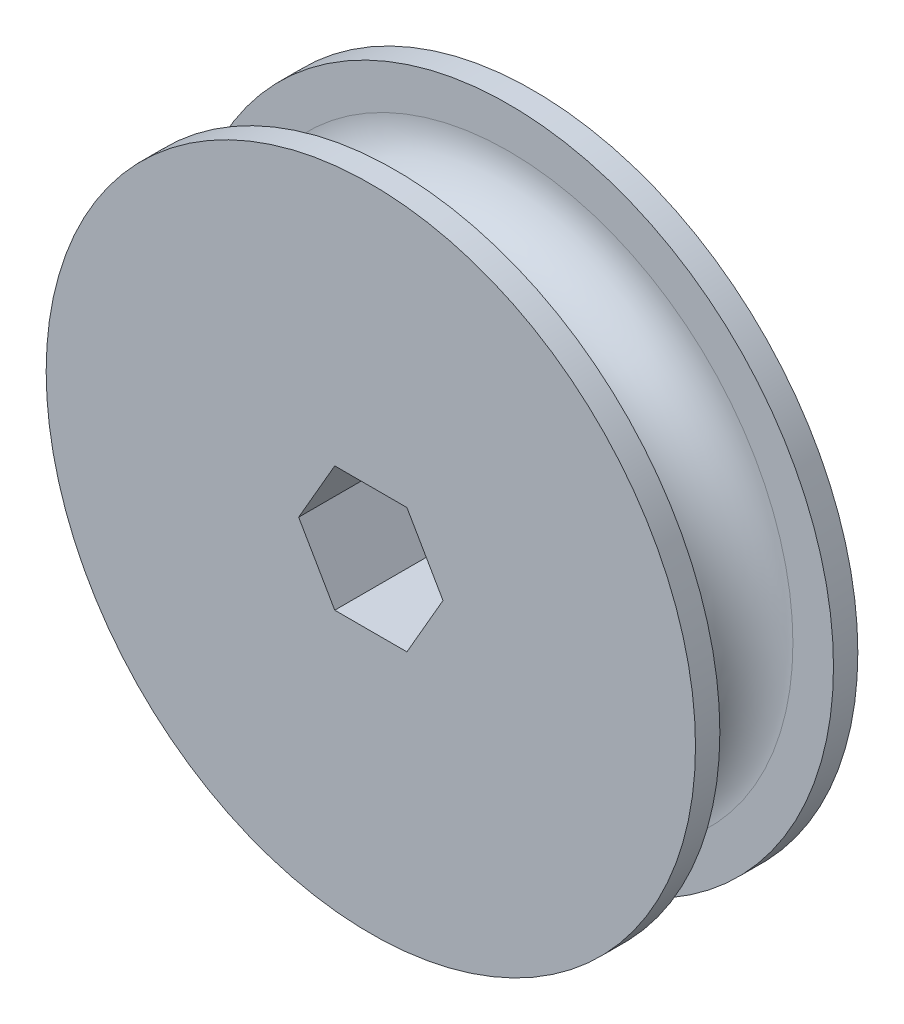
ISO-10303-21;
HEADER;
FILE_DESCRIPTION(('STEP AP214'),'2;1');
FILE_NAME('part.step','',(''),(''),'','','');
FILE_SCHEMA(('AUTOMOTIVE_DESIGN { 1 0 10303 214 1 1 1 1 }'));
ENDSEC;
DATA;
#1=APPLICATION_CONTEXT('core data for automotive mechanical design processes');
#2=APPLICATION_PROTOCOL_DEFINITION('international standard','automotive_design',2000,#1);
#3=PRODUCT_CONTEXT('',#1,'mechanical');
#4=PRODUCT('Part','Part','',(#3));
#5=PRODUCT_RELATED_PRODUCT_CATEGORY('part','',(#4));
#6=PRODUCT_DEFINITION_FORMATION('','',#4);
#7=PRODUCT_DEFINITION_CONTEXT('part definition',#1,'design');
#8=PRODUCT_DEFINITION('design','',#6,#7);
#9=PRODUCT_DEFINITION_SHAPE('','',#8);
#10=(LENGTH_UNIT() NAMED_UNIT(*) SI_UNIT(.MILLI.,.METRE.));
#11=(NAMED_UNIT(*) PLANE_ANGLE_UNIT() SI_UNIT($,.RADIAN.));
#12=(NAMED_UNIT(*) SI_UNIT($,.STERADIAN.) SOLID_ANGLE_UNIT());
#13=UNCERTAINTY_MEASURE_WITH_UNIT(LENGTH_MEASURE(1.E-05),#10,'distance_accuracy_value','');
#14=(GEOMETRIC_REPRESENTATION_CONTEXT(3) GLOBAL_UNCERTAINTY_ASSIGNED_CONTEXT((#13)) GLOBAL_UNIT_ASSIGNED_CONTEXT((#10,
#11,#12)) REPRESENTATION_CONTEXT('',''));
#15=CARTESIAN_POINT('',(0.,0.,0.));
#16=DIRECTION('',(0.,0.,1.));
#17=DIRECTION('',(1.,0.,0.));
#18=AXIS2_PLACEMENT_3D('',#15,#16,#17);
#19=CARTESIAN_POINT('',(0.,0.,6.35));
#20=DIRECTION('',(0.,0.,-1.));
#21=DIRECTION('',(-1.,0.,0.));
#22=AXIS2_PLACEMENT_3D('',#19,#20,#21);
#23=CYLINDRICAL_SURFACE('',#22,25.4);
#24=CARTESIAN_POINT('',(0.,0.,-6.35));
#25=DIRECTION('',(0.,0.,1.));
#26=DIRECTION('',(1.,0.,0.));
#27=AXIS2_PLACEMENT_3D('',#24,#25,#26);
#28=CIRCLE('',#27,25.4);
#29=CARTESIAN_POINT('',(25.4,0.,-6.35));
#30=VERTEX_POINT('',#29);
#31=EDGE_CURVE('E36',#30,#30,#28,.T.);
#32=ORIENTED_EDGE('',*,*,#31,.T.);
#33=EDGE_LOOP('',(#32));
#34=FACE_BOUND('',#33,.T.);
#35=CARTESIAN_POINT('',(0.,0.,-4.445));
#36=DIRECTION('',(0.,0.,1.));
#37=DIRECTION('',(1.,0.,0.));
#38=AXIS2_PLACEMENT_3D('',#35,#36,#37);
#39=CIRCLE('',#38,25.4);
#40=CARTESIAN_POINT('',(25.4,0.,-4.445));
#41=VERTEX_POINT('',#40);
#42=EDGE_CURVE('E143',#41,#41,#39,.T.);
#43=ORIENTED_EDGE('',*,*,#42,.F.);
#44=EDGE_LOOP('',(#43));
#45=FACE_BOUND('',#44,.T.);
#46=ADVANCED_FACE('F33',(#34,#45),#23,.T.);
#47=CARTESIAN_POINT('',(0.,0.,-6.35));
#48=DIRECTION('',(0.,0.,1.));
#49=DIRECTION('',(1.,0.,0.));
#50=AXIS2_PLACEMENT_3D('',#47,#48,#49);
#51=PLANE('',#50);
#52=DIRECTION('',(0.499999999999998,0.86602540378444,0.));
#53=VECTOR('',#52,1.);
#54=CARTESIAN_POINT('',(-5.64590828240534,0.,-6.35));
#55=LINE('',#54,#53);
#56=CARTESIAN_POINT('',(-5.64590828240534,0.,-6.35));
#57=VERTEX_POINT('',#56);
#58=CARTESIAN_POINT('',(-2.82295414120268,4.8895,-6.35));
#59=VERTEX_POINT('',#58);
#60=EDGE_CURVE('E118',#57,#59,#55,.T.);
#61=ORIENTED_EDGE('',*,*,#60,.F.);
#62=DIRECTION('',(-0.499999999999999,0.86602540378444,0.));
#63=VECTOR('',#62,1.);
#64=CARTESIAN_POINT('',(-2.82295414120268,-4.8895,-6.35));
#65=LINE('',#64,#63);
#66=CARTESIAN_POINT('',(-2.82295414120268,-4.8895,-6.35));
#67=VERTEX_POINT('',#66);
#68=EDGE_CURVE('E47',#67,#57,#65,.T.);
#69=ORIENTED_EDGE('',*,*,#68,.F.);
#70=DIRECTION('',(-1.,0.,0.));
#71=VECTOR('',#70,1.);
#72=CARTESIAN_POINT('',(2.82295414120269,-4.8895,-6.35));
#73=LINE('',#72,#71);
#74=CARTESIAN_POINT('',(2.82295414120269,-4.8895,-6.35));
#75=VERTEX_POINT('',#74);
#76=EDGE_CURVE('E104',#75,#67,#73,.T.);
#77=ORIENTED_EDGE('',*,*,#76,.F.);
#78=DIRECTION('',(-0.499999999999998,-0.86602540378444,0.));
#79=VECTOR('',#78,1.);
#80=CARTESIAN_POINT('',(5.64590828240535,0.,-6.35));
#81=LINE('',#80,#79);
#82=CARTESIAN_POINT('',(5.64590828240535,0.,-6.35));
#83=VERTEX_POINT('',#82);
#84=EDGE_CURVE('E107',#83,#75,#81,.T.);
#85=ORIENTED_EDGE('',*,*,#84,.F.);
#86=DIRECTION('',(0.499999999999999,-0.86602540378444,0.));
#87=VECTOR('',#86,1.);
#88=CARTESIAN_POINT('',(2.82295414120268,4.8895,-6.35));
#89=LINE('',#88,#87);
#90=CARTESIAN_POINT('',(2.82295414120268,4.8895,-6.35));
#91=VERTEX_POINT('',#90);
#92=EDGE_CURVE('E123',#91,#83,#89,.T.);
#93=ORIENTED_EDGE('',*,*,#92,.F.);
#94=DIRECTION('',(1.,0.,0.));
#95=VECTOR('',#94,1.);
#96=CARTESIAN_POINT('',(-2.82295414120268,4.8895,-6.35));
#97=LINE('',#96,#95);
#98=EDGE_CURVE('E120',#59,#91,#97,.T.);
#99=ORIENTED_EDGE('',*,*,#98,.F.);
#100=EDGE_LOOP('',(#61,#69,#77,#85,#93,#99));
#101=FACE_BOUND('',#100,.T.);
#102=ORIENTED_EDGE('',*,*,#31,.F.);
#103=EDGE_LOOP('',(#102));
#104=FACE_BOUND('',#103,.T.);
#105=ADVANCED_FACE('F155',(#101,#104),#51,.F.);
#106=CARTESIAN_POINT('',(0.,0.,0.));
#107=DIRECTION('',(0.,0.,1.));
#108=DIRECTION('',(1.,0.,0.));
#109=AXIS2_PLACEMENT_3D('',#106,#107,#108);
#110=TOROIDAL_SURFACE('',#109,22.225,4.445);
#111=CARTESIAN_POINT('',(0.,0.,-4.445));
#112=DIRECTION('',(0.,0.,1.));
#113=DIRECTION('',(1.,0.,0.));
#114=AXIS2_PLACEMENT_3D('',#111,#112,#113);
#115=CIRCLE('',#114,22.225);
#116=CARTESIAN_POINT('',(22.225,0.,-4.445));
#117=VERTEX_POINT('',#116);
#118=EDGE_CURVE('E146',#117,#117,#115,.T.);
#119=ORIENTED_EDGE('',*,*,#118,.T.);
#120=EDGE_LOOP('',(#119));
#121=FACE_BOUND('',#120,.T.);
#122=CARTESIAN_POINT('',(0.,0.,4.445));
#123=DIRECTION('',(0.,0.,1.));
#124=DIRECTION('',(1.,0.,0.));
#125=AXIS2_PLACEMENT_3D('',#122,#123,#124);
#126=CIRCLE('',#125,22.225);
#127=CARTESIAN_POINT('',(22.225,0.,4.445));
#128=VERTEX_POINT('',#127);
#129=EDGE_CURVE('E130',#128,#128,#126,.T.);
#130=ORIENTED_EDGE('',*,*,#129,.F.);
#131=EDGE_LOOP('',(#130));
#132=FACE_BOUND('',#131,.T.);
#133=ADVANCED_FACE('F157',(#121,#132),#110,.F.);
#134=CARTESIAN_POINT('',(-22.225,0.,-4.445));
#135=DIRECTION('',(0.,0.,1.));
#136=DIRECTION('',(1.,0.,0.));
#137=AXIS2_PLACEMENT_3D('',#134,#135,#136);
#138=PLANE('',#137);
#139=ORIENTED_EDGE('',*,*,#42,.T.);
#140=EDGE_LOOP('',(#139));
#141=FACE_BOUND('',#140,.T.);
#142=ORIENTED_EDGE('',*,*,#118,.F.);
#143=EDGE_LOOP('',(#142));
#144=FACE_BOUND('',#143,.T.);
#145=ADVANCED_FACE('F163',(#141,#144),#138,.T.);
#146=CARTESIAN_POINT('',(-22.225,0.,4.445));
#147=DIRECTION('',(0.,0.,-1.));
#148=DIRECTION('',(-1.,0.,0.));
#149=AXIS2_PLACEMENT_3D('',#146,#147,#148);
#150=PLANE('',#149);
#151=ORIENTED_EDGE('',*,*,#129,.T.);
#152=EDGE_LOOP('',(#151));
#153=FACE_BOUND('',#152,.T.);
#154=CARTESIAN_POINT('',(0.,0.,4.445));
#155=DIRECTION('',(0.,0.,1.));
#156=DIRECTION('',(1.,0.,0.));
#157=AXIS2_PLACEMENT_3D('',#154,#155,#156);
#158=CIRCLE('',#157,25.4);
#159=CARTESIAN_POINT('',(25.4,0.,4.445));
#160=VERTEX_POINT('',#159);
#161=EDGE_CURVE('E140',#160,#160,#158,.T.);
#162=ORIENTED_EDGE('',*,*,#161,.F.);
#163=EDGE_LOOP('',(#162));
#164=FACE_BOUND('',#163,.T.);
#165=ADVANCED_FACE('F168',(#153,#164),#150,.T.);
#166=CARTESIAN_POINT('',(0.,0.,6.35));
#167=DIRECTION('',(0.,0.,1.));
#168=DIRECTION('',(1.,0.,0.));
#169=AXIS2_PLACEMENT_3D('',#166,#167,#168);
#170=PLANE('',#169);
#171=DIRECTION('',(-0.499999999999999,0.86602540378444,0.));
#172=VECTOR('',#171,1.);
#173=CARTESIAN_POINT('',(-2.82295414120268,-4.8895,6.35));
#174=LINE('',#173,#172);
#175=CARTESIAN_POINT('',(-2.82295414120268,-4.8895,6.35));
#176=VERTEX_POINT('',#175);
#177=CARTESIAN_POINT('',(-5.64590828240534,0.,6.35));
#178=VERTEX_POINT('',#177);
#179=EDGE_CURVE('E87',#176,#178,#174,.T.);
#180=ORIENTED_EDGE('',*,*,#179,.T.);
#181=DIRECTION('',(0.499999999999998,0.86602540378444,0.));
#182=VECTOR('',#181,1.);
#183=CARTESIAN_POINT('',(-5.64590828240534,0.,6.35));
#184=LINE('',#183,#182);
#185=CARTESIAN_POINT('',(-2.82295414120268,4.8895,6.35));
#186=VERTEX_POINT('',#185);
#187=EDGE_CURVE('E96',#178,#186,#184,.T.);
#188=ORIENTED_EDGE('',*,*,#187,.T.);
#189=DIRECTION('',(1.,0.,0.));
#190=VECTOR('',#189,1.);
#191=CARTESIAN_POINT('',(-2.82295414120268,4.8895,6.35));
#192=LINE('',#191,#190);
#193=CARTESIAN_POINT('',(2.82295414120268,4.8895,6.35));
#194=VERTEX_POINT('',#193);
#195=EDGE_CURVE('E55',#186,#194,#192,.T.);
#196=ORIENTED_EDGE('',*,*,#195,.T.);
#197=DIRECTION('',(0.499999999999999,-0.86602540378444,0.));
#198=VECTOR('',#197,1.);
#199=CARTESIAN_POINT('',(2.82295414120268,4.8895,6.35));
#200=LINE('',#199,#198);
#201=CARTESIAN_POINT('',(5.64590828240535,0.,6.35));
#202=VERTEX_POINT('',#201);
#203=EDGE_CURVE('E111',#194,#202,#200,.T.);
#204=ORIENTED_EDGE('',*,*,#203,.T.);
#205=DIRECTION('',(-0.499999999999998,-0.86602540378444,0.));
#206=VECTOR('',#205,1.);
#207=CARTESIAN_POINT('',(5.64590828240535,0.,6.35));
#208=LINE('',#207,#206);
#209=CARTESIAN_POINT('',(2.82295414120269,-4.8895,6.35));
#210=VERTEX_POINT('',#209);
#211=EDGE_CURVE('E114',#202,#210,#208,.T.);
#212=ORIENTED_EDGE('',*,*,#211,.T.);
#213=DIRECTION('',(-1.,0.,0.));
#214=VECTOR('',#213,1.);
#215=CARTESIAN_POINT('',(2.82295414120269,-4.8895,6.35));
#216=LINE('',#215,#214);
#217=EDGE_CURVE('E93',#210,#176,#216,.T.);
#218=ORIENTED_EDGE('',*,*,#217,.T.);
#219=EDGE_LOOP('',(#180,#188,#196,#204,#212,#218));
#220=FACE_BOUND('',#219,.T.);
#221=CARTESIAN_POINT('',(0.,0.,6.35));
#222=DIRECTION('',(0.,0.,1.));
#223=DIRECTION('',(1.,0.,0.));
#224=AXIS2_PLACEMENT_3D('',#221,#222,#223);
#225=CIRCLE('',#224,25.4);
#226=CARTESIAN_POINT('',(25.4,0.,6.35));
#227=VERTEX_POINT('',#226);
#228=EDGE_CURVE('E11',#227,#227,#225,.T.);
#229=ORIENTED_EDGE('',*,*,#228,.T.);
#230=EDGE_LOOP('',(#229));
#231=FACE_BOUND('',#230,.T.);
#232=ADVANCED_FACE('F100',(#220,#231),#170,.T.);
#233=ORIENTED_EDGE('',*,*,#228,.F.);
#234=EDGE_LOOP('',(#233));
#235=FACE_BOUND('',#234,.T.);
#236=ORIENTED_EDGE('',*,*,#161,.T.);
#237=EDGE_LOOP('',(#236));
#238=FACE_BOUND('',#237,.T.);
#239=ADVANCED_FACE('F165',(#235,#238),#23,.T.);
#240=CARTESIAN_POINT('',(-2.82295414120268,-4.8895,6.35));
#241=DIRECTION('',(-0.866025403784439,-0.499999999999999,0.));
#242=DIRECTION('',(0.499999999999999,-0.866025403784439,0.));
#243=AXIS2_PLACEMENT_3D('',#240,#241,#242);
#244=PLANE('',#243);
#245=ORIENTED_EDGE('',*,*,#68,.T.);
#246=DIRECTION('',(0.,0.,-1.));
#247=VECTOR('',#246,1.);
#248=CARTESIAN_POINT('',(-5.64590828240534,0.,6.35));
#249=LINE('',#248,#247);
#250=EDGE_CURVE('E83',#178,#57,#249,.T.);
#251=ORIENTED_EDGE('',*,*,#250,.F.);
#252=ORIENTED_EDGE('',*,*,#179,.F.);
#253=DIRECTION('',(0.,0.,-1.));
#254=VECTOR('',#253,1.);
#255=CARTESIAN_POINT('',(-2.82295414120268,-4.8895,6.35));
#256=LINE('',#255,#254);
#257=EDGE_CURVE('E128',#176,#67,#256,.T.);
#258=ORIENTED_EDGE('',*,*,#257,.T.);
#259=EDGE_LOOP('',(#245,#251,#252,#258));
#260=FACE_BOUND('',#259,.T.);
#261=ADVANCED_FACE('F85',(#260),#244,.F.);
#262=CARTESIAN_POINT('',(2.82295414120269,-4.8895,6.35));
#263=DIRECTION('',(0.,-1.,0.));
#264=DIRECTION('',(0.,0.,-1.));
#265=AXIS2_PLACEMENT_3D('',#262,#263,#264);
#266=PLANE('',#265);
#267=ORIENTED_EDGE('',*,*,#76,.T.);
#268=ORIENTED_EDGE('',*,*,#257,.F.);
#269=ORIENTED_EDGE('',*,*,#217,.F.);
#270=DIRECTION('',(0.,0.,-1.));
#271=VECTOR('',#270,1.);
#272=CARTESIAN_POINT('',(2.82295414120269,-4.8895,6.35));
#273=LINE('',#272,#271);
#274=EDGE_CURVE('E131',#210,#75,#273,.T.);
#275=ORIENTED_EDGE('',*,*,#274,.T.);
#276=EDGE_LOOP('',(#267,#268,#269,#275));
#277=FACE_BOUND('',#276,.T.);
#278=ADVANCED_FACE('F178',(#277),#266,.F.);
#279=CARTESIAN_POINT('',(5.64590828240535,0.,6.35));
#280=DIRECTION('',(0.86602540378444,-0.499999999999998,0.));
#281=DIRECTION('',(0.499999999999998,0.86602540378444,0.));
#282=AXIS2_PLACEMENT_3D('',#279,#280,#281);
#283=PLANE('',#282);
#284=ORIENTED_EDGE('',*,*,#84,.T.);
#285=ORIENTED_EDGE('',*,*,#274,.F.);
#286=ORIENTED_EDGE('',*,*,#211,.F.);
#287=DIRECTION('',(0.,0.,-1.));
#288=VECTOR('',#287,1.);
#289=CARTESIAN_POINT('',(5.64590828240535,0.,6.35));
#290=LINE('',#289,#288);
#291=EDGE_CURVE('E133',#202,#83,#290,.T.);
#292=ORIENTED_EDGE('',*,*,#291,.T.);
#293=EDGE_LOOP('',(#284,#285,#286,#292));
#294=FACE_BOUND('',#293,.T.);
#295=ADVANCED_FACE('F187',(#294),#283,.F.);
#296=CARTESIAN_POINT('',(2.82295414120268,4.8895,6.35));
#297=DIRECTION('',(0.866025403784439,0.499999999999999,0.));
#298=DIRECTION('',(-0.499999999999999,0.866025403784439,0.));
#299=AXIS2_PLACEMENT_3D('',#296,#297,#298);
#300=PLANE('',#299);
#301=ORIENTED_EDGE('',*,*,#92,.T.);
#302=ORIENTED_EDGE('',*,*,#291,.F.);
#303=ORIENTED_EDGE('',*,*,#203,.F.);
#304=DIRECTION('',(0.,0.,-1.));
#305=VECTOR('',#304,1.);
#306=CARTESIAN_POINT('',(2.82295414120268,4.8895,6.35));
#307=LINE('',#306,#305);
#308=EDGE_CURVE('E135',#194,#91,#307,.T.);
#309=ORIENTED_EDGE('',*,*,#308,.T.);
#310=EDGE_LOOP('',(#301,#302,#303,#309));
#311=FACE_BOUND('',#310,.T.);
#312=ADVANCED_FACE('F184',(#311),#300,.F.);
#313=CARTESIAN_POINT('',(-2.82295414120268,4.8895,6.35));
#314=DIRECTION('',(0.,1.,0.));
#315=DIRECTION('',(0.,0.,1.));
#316=AXIS2_PLACEMENT_3D('',#313,#314,#315);
#317=PLANE('',#316);
#318=ORIENTED_EDGE('',*,*,#98,.T.);
#319=ORIENTED_EDGE('',*,*,#308,.F.);
#320=ORIENTED_EDGE('',*,*,#195,.F.);
#321=DIRECTION('',(0.,0.,-1.));
#322=VECTOR('',#321,1.);
#323=CARTESIAN_POINT('',(-2.82295414120268,4.8895,6.35));
#324=LINE('',#323,#322);
#325=EDGE_CURVE('E92',#186,#59,#324,.T.);
#326=ORIENTED_EDGE('',*,*,#325,.T.);
#327=EDGE_LOOP('',(#318,#319,#320,#326));
#328=FACE_BOUND('',#327,.T.);
#329=ADVANCED_FACE('F181',(#328),#317,.F.);
#330=CARTESIAN_POINT('',(-5.64590828240534,0.,6.35));
#331=DIRECTION('',(-0.86602540378444,0.499999999999998,0.));
#332=DIRECTION('',(-0.499999999999998,-0.86602540378444,0.));
#333=AXIS2_PLACEMENT_3D('',#330,#331,#332);
#334=PLANE('',#333);
#335=ORIENTED_EDGE('',*,*,#60,.T.);
#336=ORIENTED_EDGE('',*,*,#325,.F.);
#337=ORIENTED_EDGE('',*,*,#187,.F.);
#338=ORIENTED_EDGE('',*,*,#250,.T.);
#339=EDGE_LOOP('',(#335,#336,#337,#338));
#340=FACE_BOUND('',#339,.T.);
#341=ADVANCED_FACE('F97',(#340),#334,.F.);
#342=CLOSED_SHELL('',(#46,#105,#133,#145,#165,#232,#239,#261,#278,#295,#312,#329,#341));
#343=MANIFOLD_SOLID_BREP('B2',#342);
#344=ADVANCED_BREP_SHAPE_REPRESENTATION('',(#18,#343),#14);
#345=SHAPE_DEFINITION_REPRESENTATION(#9,#344);
ENDSEC;
END-ISO-10303-21;
